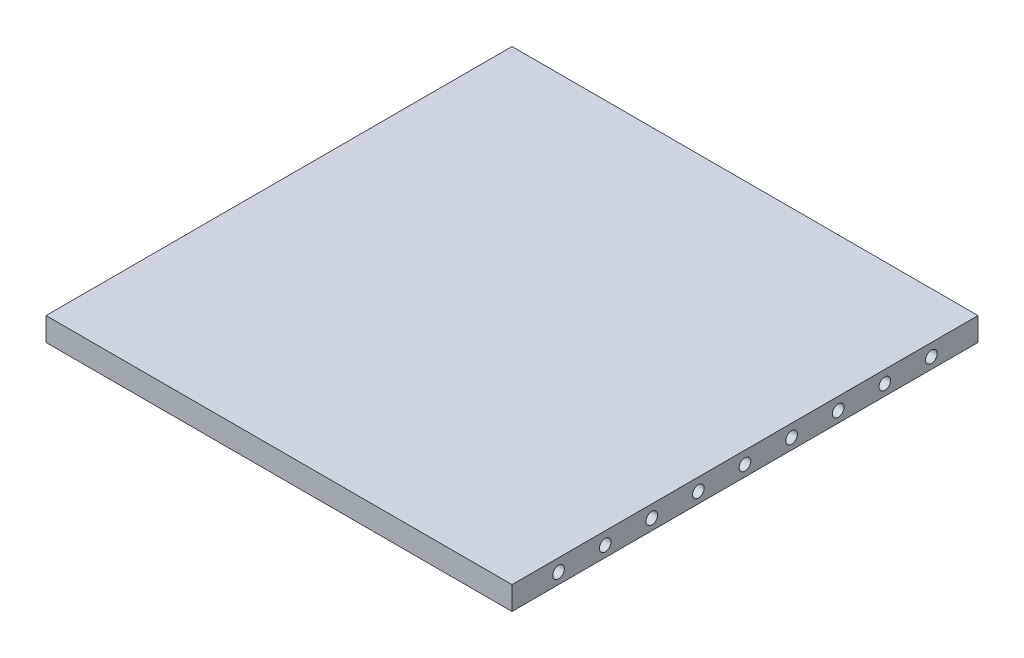
ISO-10303-21;
HEADER;
FILE_DESCRIPTION(('STEP AP214'),'2;1');
FILE_NAME('part.step','',(''),(''),'','','');
FILE_SCHEMA(('AUTOMOTIVE_DESIGN { 1 0 10303 214 1 1 1 1 }'));
ENDSEC;
DATA;
#1=APPLICATION_CONTEXT('core data for automotive mechanical design processes');
#2=APPLICATION_PROTOCOL_DEFINITION('international standard','automotive_design',2000,#1);
#3=PRODUCT_CONTEXT('',#1,'mechanical');
#4=PRODUCT('Part','Part','',(#3));
#5=PRODUCT_RELATED_PRODUCT_CATEGORY('part','',(#4));
#6=PRODUCT_DEFINITION_FORMATION('','',#4);
#7=PRODUCT_DEFINITION_CONTEXT('part definition',#1,'design');
#8=PRODUCT_DEFINITION('design','',#6,#7);
#9=PRODUCT_DEFINITION_SHAPE('','',#8);
#10=(LENGTH_UNIT() NAMED_UNIT(*) SI_UNIT(.MILLI.,.METRE.));
#11=(NAMED_UNIT(*) PLANE_ANGLE_UNIT() SI_UNIT($,.RADIAN.));
#12=(NAMED_UNIT(*) SI_UNIT($,.STERADIAN.) SOLID_ANGLE_UNIT());
#13=UNCERTAINTY_MEASURE_WITH_UNIT(LENGTH_MEASURE(1.E-05),#10,'distance_accuracy_value','');
#14=(GEOMETRIC_REPRESENTATION_CONTEXT(3) GLOBAL_UNCERTAINTY_ASSIGNED_CONTEXT((#13)) GLOBAL_UNIT_ASSIGNED_CONTEXT((#10,
#11,#12)) REPRESENTATION_CONTEXT('',''));
#15=CARTESIAN_POINT('',(0.,0.,0.));
#16=DIRECTION('',(0.,0.,1.));
#17=DIRECTION('',(1.,0.,0.));
#18=AXIS2_PLACEMENT_3D('',#15,#16,#17);
#19=CARTESIAN_POINT('',(63.5,6.35,63.5));
#20=DIRECTION('',(-1.,0.,0.));
#21=DIRECTION('',(0.,0.,1.));
#22=AXIS2_PLACEMENT_3D('',#19,#20,#21);
#23=PLANE('',#22);
#24=CARTESIAN_POINT('',(63.5,2.9738017173031,-38.1));
#25=DIRECTION('',(-1.,0.,0.));
#26=DIRECTION('',(0.,0.,1.));
#27=AXIS2_PLACEMENT_3D('',#24,#25,#26);
#28=CIRCLE('',#27,1.5875);
#29=CARTESIAN_POINT('',(63.5,2.9738017173031,-36.5125));
#30=VERTEX_POINT('',#29);
#31=EDGE_CURVE('E315',#30,#30,#28,.F.);
#32=ORIENTED_EDGE('',*,*,#31,.F.);
#33=EDGE_LOOP('',(#32));
#34=FACE_BOUND('',#33,.T.);
#35=CARTESIAN_POINT('',(63.5,2.9738017173031,-50.8));
#36=DIRECTION('',(-1.,0.,0.));
#37=DIRECTION('',(0.,0.,1.));
#38=AXIS2_PLACEMENT_3D('',#35,#36,#37);
#39=CIRCLE('',#38,1.5875);
#40=CARTESIAN_POINT('',(63.5,2.9738017173031,-49.2125));
#41=VERTEX_POINT('',#40);
#42=EDGE_CURVE('E109',#41,#41,#39,.F.);
#43=ORIENTED_EDGE('',*,*,#42,.F.);
#44=EDGE_LOOP('',(#43));
#45=FACE_BOUND('',#44,.T.);
#46=DIRECTION('',(0.,0.,-1.));
#47=VECTOR('',#46,1.);
#48=CARTESIAN_POINT('',(63.5,0.,63.5));
#49=LINE('',#48,#47);
#50=CARTESIAN_POINT('',(63.5,0.,63.5));
#51=VERTEX_POINT('',#50);
#52=CARTESIAN_POINT('',(63.5,0.,-63.5));
#53=VERTEX_POINT('',#52);
#54=EDGE_CURVE('E106',#51,#53,#49,.T.);
#55=ORIENTED_EDGE('',*,*,#54,.T.);
#56=DIRECTION('',(0.,-1.,0.));
#57=VECTOR('',#56,1.);
#58=CARTESIAN_POINT('',(63.5,6.35,-63.5));
#59=LINE('',#58,#57);
#60=CARTESIAN_POINT('',(63.5,6.35,-63.5));
#61=VERTEX_POINT('',#60);
#62=EDGE_CURVE('E96',#61,#53,#59,.T.);
#63=ORIENTED_EDGE('',*,*,#62,.F.);
#64=DIRECTION('',(0.,0.,-1.));
#65=VECTOR('',#64,1.);
#66=CARTESIAN_POINT('',(63.5,6.35,63.5));
#67=LINE('',#66,#65);
#68=CARTESIAN_POINT('',(63.5,6.35,63.5));
#69=VERTEX_POINT('',#68);
#70=EDGE_CURVE('E90',#69,#61,#67,.T.);
#71=ORIENTED_EDGE('',*,*,#70,.F.);
#72=DIRECTION('',(0.,-1.,0.));
#73=VECTOR('',#72,1.);
#74=CARTESIAN_POINT('',(63.5,6.35,63.5));
#75=LINE('',#74,#73);
#76=EDGE_CURVE('E102',#69,#51,#75,.T.);
#77=ORIENTED_EDGE('',*,*,#76,.T.);
#78=EDGE_LOOP('',(#55,#63,#71,#77));
#79=FACE_BOUND('',#78,.T.);
#80=CARTESIAN_POINT('',(63.5,2.9738017173031,-25.4));
#81=DIRECTION('',(-1.,0.,0.));
#82=DIRECTION('',(0.,0.,1.));
#83=AXIS2_PLACEMENT_3D('',#80,#81,#82);
#84=CIRCLE('',#83,1.5875);
#85=CARTESIAN_POINT('',(63.5,2.9738017173031,-23.8125));
#86=VERTEX_POINT('',#85);
#87=EDGE_CURVE('E119',#86,#86,#84,.F.);
#88=ORIENTED_EDGE('',*,*,#87,.F.);
#89=EDGE_LOOP('',(#88));
#90=FACE_BOUND('',#89,.T.);
#91=CARTESIAN_POINT('',(63.5,2.9738017173031,-12.7));
#92=DIRECTION('',(-1.,0.,0.));
#93=DIRECTION('',(0.,0.,1.));
#94=AXIS2_PLACEMENT_3D('',#91,#92,#93);
#95=CIRCLE('',#94,1.5875);
#96=CARTESIAN_POINT('',(63.5,2.9738017173031,-11.1125));
#97=VERTEX_POINT('',#96);
#98=EDGE_CURVE('E125',#97,#97,#95,.F.);
#99=ORIENTED_EDGE('',*,*,#98,.F.);
#100=EDGE_LOOP('',(#99));
#101=FACE_BOUND('',#100,.T.);
#102=CARTESIAN_POINT('',(63.5,2.9738017173031,0.));
#103=DIRECTION('',(-1.,0.,0.));
#104=DIRECTION('',(0.,0.,1.));
#105=AXIS2_PLACEMENT_3D('',#102,#103,#104);
#106=CIRCLE('',#105,1.5875);
#107=CARTESIAN_POINT('',(63.5,2.9738017173031,1.5875));
#108=VERTEX_POINT('',#107);
#109=EDGE_CURVE('E131',#108,#108,#106,.F.);
#110=ORIENTED_EDGE('',*,*,#109,.F.);
#111=EDGE_LOOP('',(#110));
#112=FACE_BOUND('',#111,.T.);
#113=CARTESIAN_POINT('',(63.5,2.9738017173031,12.7));
#114=DIRECTION('',(-1.,0.,0.));
#115=DIRECTION('',(0.,0.,1.));
#116=AXIS2_PLACEMENT_3D('',#113,#114,#115);
#117=CIRCLE('',#116,1.5875);
#118=CARTESIAN_POINT('',(63.5,2.9738017173031,14.2875));
#119=VERTEX_POINT('',#118);
#120=EDGE_CURVE('E137',#119,#119,#117,.F.);
#121=ORIENTED_EDGE('',*,*,#120,.F.);
#122=EDGE_LOOP('',(#121));
#123=FACE_BOUND('',#122,.T.);
#124=CARTESIAN_POINT('',(63.5,2.9738017173031,25.4));
#125=DIRECTION('',(-1.,0.,0.));
#126=DIRECTION('',(0.,0.,1.));
#127=AXIS2_PLACEMENT_3D('',#124,#125,#126);
#128=CIRCLE('',#127,1.5875);
#129=CARTESIAN_POINT('',(63.5,2.9738017173031,26.9875));
#130=VERTEX_POINT('',#129);
#131=EDGE_CURVE('E143',#130,#130,#128,.F.);
#132=ORIENTED_EDGE('',*,*,#131,.F.);
#133=EDGE_LOOP('',(#132));
#134=FACE_BOUND('',#133,.T.);
#135=CARTESIAN_POINT('',(63.5,2.9738017173031,38.1));
#136=DIRECTION('',(-1.,0.,0.));
#137=DIRECTION('',(0.,0.,1.));
#138=AXIS2_PLACEMENT_3D('',#135,#136,#137);
#139=CIRCLE('',#138,1.5875);
#140=CARTESIAN_POINT('',(63.5,2.9738017173031,39.6875));
#141=VERTEX_POINT('',#140);
#142=EDGE_CURVE('E149',#141,#141,#139,.F.);
#143=ORIENTED_EDGE('',*,*,#142,.F.);
#144=EDGE_LOOP('',(#143));
#145=FACE_BOUND('',#144,.T.);
#146=CARTESIAN_POINT('',(63.5,2.9738017173031,50.8));
#147=DIRECTION('',(-1.,0.,0.));
#148=DIRECTION('',(0.,0.,1.));
#149=AXIS2_PLACEMENT_3D('',#146,#147,#148);
#150=CIRCLE('',#149,1.5875);
#151=CARTESIAN_POINT('',(63.5,2.9738017173031,52.3875));
#152=VERTEX_POINT('',#151);
#153=EDGE_CURVE('E11',#152,#152,#150,.F.);
#154=ORIENTED_EDGE('',*,*,#153,.F.);
#155=EDGE_LOOP('',(#154));
#156=FACE_BOUND('',#155,.T.);
#157=ADVANCED_FACE('F37',(#34,#45,#79,#90,#101,#112,#123,#134,#145,#156),#23,.F.);
#158=CARTESIAN_POINT('',(-63.5,6.35,-63.5));
#159=DIRECTION('',(0.,0.,1.));
#160=DIRECTION('',(1.,0.,0.));
#161=AXIS2_PLACEMENT_3D('',#158,#159,#160);
#162=PLANE('',#161);
#163=DIRECTION('',(-1.,0.,0.));
#164=VECTOR('',#163,1.);
#165=CARTESIAN_POINT('',(-63.5,0.,-63.5));
#166=LINE('',#165,#164);
#167=CARTESIAN_POINT('',(-63.5,0.,-63.5));
#168=VERTEX_POINT('',#167);
#169=EDGE_CURVE('E95',#53,#168,#166,.T.);
#170=ORIENTED_EDGE('',*,*,#169,.T.);
#171=DIRECTION('',(0.,-1.,0.));
#172=VECTOR('',#171,1.);
#173=CARTESIAN_POINT('',(-63.5,6.35,-63.5));
#174=LINE('',#173,#172);
#175=CARTESIAN_POINT('',(-63.5,6.35,-63.5));
#176=VERTEX_POINT('',#175);
#177=EDGE_CURVE('E93',#176,#168,#174,.T.);
#178=ORIENTED_EDGE('',*,*,#177,.F.);
#179=DIRECTION('',(-1.,0.,0.));
#180=VECTOR('',#179,1.);
#181=CARTESIAN_POINT('',(-63.5,6.35,-63.5));
#182=LINE('',#181,#180);
#183=EDGE_CURVE('E85',#61,#176,#182,.T.);
#184=ORIENTED_EDGE('',*,*,#183,.F.);
#185=ORIENTED_EDGE('',*,*,#62,.T.);
#186=EDGE_LOOP('',(#170,#178,#184,#185));
#187=FACE_BOUND('',#186,.T.);
#188=ADVANCED_FACE('F94',(#187),#162,.F.);
#189=CARTESIAN_POINT('',(-63.5,6.35,63.5));
#190=DIRECTION('',(1.,0.,0.));
#191=DIRECTION('',(0.,0.,-1.));
#192=AXIS2_PLACEMENT_3D('',#189,#190,#191);
#193=PLANE('',#192);
#194=CARTESIAN_POINT('',(-63.5,2.9738017173031,-38.1));
#195=DIRECTION('',(-1.,0.,0.));
#196=DIRECTION('',(0.,0.,1.));
#197=AXIS2_PLACEMENT_3D('',#194,#195,#196);
#198=CIRCLE('',#197,1.5875);
#199=CARTESIAN_POINT('',(-63.5,2.9738017173031,-36.5125));
#200=VERTEX_POINT('',#199);
#201=EDGE_CURVE('E318',#200,#200,#198,.T.);
#202=ORIENTED_EDGE('',*,*,#201,.F.);
#203=EDGE_LOOP('',(#202));
#204=FACE_BOUND('',#203,.T.);
#205=CARTESIAN_POINT('',(-63.5,2.9738017173031,-50.8));
#206=DIRECTION('',(-1.,0.,0.));
#207=DIRECTION('',(0.,0.,1.));
#208=AXIS2_PLACEMENT_3D('',#205,#206,#207);
#209=CIRCLE('',#208,1.5875);
#210=CARTESIAN_POINT('',(-63.5,2.9738017173031,-49.2125));
#211=VERTEX_POINT('',#210);
#212=EDGE_CURVE('E312',#211,#211,#209,.T.);
#213=ORIENTED_EDGE('',*,*,#212,.F.);
#214=EDGE_LOOP('',(#213));
#215=FACE_BOUND('',#214,.T.);
#216=DIRECTION('',(0.,0.,1.));
#217=VECTOR('',#216,1.);
#218=CARTESIAN_POINT('',(-63.5,0.,63.5));
#219=LINE('',#218,#217);
#220=CARTESIAN_POINT('',(-63.5,0.,63.5));
#221=VERTEX_POINT('',#220);
#222=EDGE_CURVE('E71',#168,#221,#219,.T.);
#223=ORIENTED_EDGE('',*,*,#222,.T.);
#224=DIRECTION('',(0.,-1.,0.));
#225=VECTOR('',#224,1.);
#226=CARTESIAN_POINT('',(-63.5,6.35,63.5));
#227=LINE('',#226,#225);
#228=CARTESIAN_POINT('',(-63.5,6.35,63.5));
#229=VERTEX_POINT('',#228);
#230=EDGE_CURVE('E97',#229,#221,#227,.T.);
#231=ORIENTED_EDGE('',*,*,#230,.F.);
#232=DIRECTION('',(0.,0.,1.));
#233=VECTOR('',#232,1.);
#234=CARTESIAN_POINT('',(-63.5,6.35,63.5));
#235=LINE('',#234,#233);
#236=EDGE_CURVE('E88',#176,#229,#235,.T.);
#237=ORIENTED_EDGE('',*,*,#236,.F.);
#238=ORIENTED_EDGE('',*,*,#177,.T.);
#239=EDGE_LOOP('',(#223,#231,#237,#238));
#240=FACE_BOUND('',#239,.T.);
#241=CARTESIAN_POINT('',(-63.5,2.9738017173031,-25.4));
#242=DIRECTION('',(-1.,0.,0.));
#243=DIRECTION('',(0.,0.,1.));
#244=AXIS2_PLACEMENT_3D('',#241,#242,#243);
#245=CIRCLE('',#244,1.5875);
#246=CARTESIAN_POINT('',(-63.5,2.9738017173031,-23.8125));
#247=VERTEX_POINT('',#246);
#248=EDGE_CURVE('E116',#247,#247,#245,.T.);
#249=ORIENTED_EDGE('',*,*,#248,.F.);
#250=EDGE_LOOP('',(#249));
#251=FACE_BOUND('',#250,.T.);
#252=CARTESIAN_POINT('',(-63.5,2.9738017173031,-12.7));
#253=DIRECTION('',(-1.,0.,0.));
#254=DIRECTION('',(0.,0.,1.));
#255=AXIS2_PLACEMENT_3D('',#252,#253,#254);
#256=CIRCLE('',#255,1.5875);
#257=CARTESIAN_POINT('',(-63.5,2.9738017173031,-11.1125));
#258=VERTEX_POINT('',#257);
#259=EDGE_CURVE('E122',#258,#258,#256,.T.);
#260=ORIENTED_EDGE('',*,*,#259,.F.);
#261=EDGE_LOOP('',(#260));
#262=FACE_BOUND('',#261,.T.);
#263=CARTESIAN_POINT('',(-63.5,2.9738017173031,0.));
#264=DIRECTION('',(-1.,0.,0.));
#265=DIRECTION('',(0.,0.,1.));
#266=AXIS2_PLACEMENT_3D('',#263,#264,#265);
#267=CIRCLE('',#266,1.5875);
#268=CARTESIAN_POINT('',(-63.5,2.9738017173031,1.5875));
#269=VERTEX_POINT('',#268);
#270=EDGE_CURVE('E128',#269,#269,#267,.T.);
#271=ORIENTED_EDGE('',*,*,#270,.F.);
#272=EDGE_LOOP('',(#271));
#273=FACE_BOUND('',#272,.T.);
#274=CARTESIAN_POINT('',(-63.5,2.9738017173031,12.7));
#275=DIRECTION('',(-1.,0.,0.));
#276=DIRECTION('',(0.,0.,1.));
#277=AXIS2_PLACEMENT_3D('',#274,#275,#276);
#278=CIRCLE('',#277,1.5875);
#279=CARTESIAN_POINT('',(-63.5,2.9738017173031,14.2875));
#280=VERTEX_POINT('',#279);
#281=EDGE_CURVE('E134',#280,#280,#278,.T.);
#282=ORIENTED_EDGE('',*,*,#281,.F.);
#283=EDGE_LOOP('',(#282));
#284=FACE_BOUND('',#283,.T.);
#285=CARTESIAN_POINT('',(-63.5,2.9738017173031,25.4));
#286=DIRECTION('',(-1.,0.,0.));
#287=DIRECTION('',(0.,0.,1.));
#288=AXIS2_PLACEMENT_3D('',#285,#286,#287);
#289=CIRCLE('',#288,1.5875);
#290=CARTESIAN_POINT('',(-63.5,2.9738017173031,26.9875));
#291=VERTEX_POINT('',#290);
#292=EDGE_CURVE('E140',#291,#291,#289,.T.);
#293=ORIENTED_EDGE('',*,*,#292,.F.);
#294=EDGE_LOOP('',(#293));
#295=FACE_BOUND('',#294,.T.);
#296=CARTESIAN_POINT('',(-63.5,2.9738017173031,38.1));
#297=DIRECTION('',(-1.,0.,0.));
#298=DIRECTION('',(0.,0.,1.));
#299=AXIS2_PLACEMENT_3D('',#296,#297,#298);
#300=CIRCLE('',#299,1.5875);
#301=CARTESIAN_POINT('',(-63.5,2.9738017173031,39.6875));
#302=VERTEX_POINT('',#301);
#303=EDGE_CURVE('E146',#302,#302,#300,.T.);
#304=ORIENTED_EDGE('',*,*,#303,.F.);
#305=EDGE_LOOP('',(#304));
#306=FACE_BOUND('',#305,.T.);
#307=CARTESIAN_POINT('',(-63.5,2.9738017173031,50.8));
#308=DIRECTION('',(-1.,0.,0.));
#309=DIRECTION('',(0.,0.,1.));
#310=AXIS2_PLACEMENT_3D('',#307,#308,#309);
#311=CIRCLE('',#310,1.5875);
#312=CARTESIAN_POINT('',(-63.5,2.9738017173031,52.3875));
#313=VERTEX_POINT('',#312);
#314=EDGE_CURVE('E46',#313,#313,#311,.T.);
#315=ORIENTED_EDGE('',*,*,#314,.F.);
#316=EDGE_LOOP('',(#315));
#317=FACE_BOUND('',#316,.T.);
#318=ADVANCED_FACE('F99',(#204,#215,#240,#251,#262,#273,#284,#295,#306,#317),#193,.F.);
#319=CARTESIAN_POINT('',(-63.5,6.35,63.5));
#320=DIRECTION('',(0.,0.,-1.));
#321=DIRECTION('',(-1.,0.,0.));
#322=AXIS2_PLACEMENT_3D('',#319,#320,#321);
#323=PLANE('',#322);
#324=DIRECTION('',(1.,0.,0.));
#325=VECTOR('',#324,1.);
#326=CARTESIAN_POINT('',(-63.5,0.,63.5));
#327=LINE('',#326,#325);
#328=EDGE_CURVE('E77',#221,#51,#327,.T.);
#329=ORIENTED_EDGE('',*,*,#328,.T.);
#330=ORIENTED_EDGE('',*,*,#76,.F.);
#331=DIRECTION('',(1.,0.,0.));
#332=VECTOR('',#331,1.);
#333=CARTESIAN_POINT('',(-63.5,6.35,63.5));
#334=LINE('',#333,#332);
#335=EDGE_CURVE('E54',#229,#69,#334,.T.);
#336=ORIENTED_EDGE('',*,*,#335,.F.);
#337=ORIENTED_EDGE('',*,*,#230,.T.);
#338=EDGE_LOOP('',(#329,#330,#336,#337));
#339=FACE_BOUND('',#338,.T.);
#340=ADVANCED_FACE('F157',(#339),#323,.F.);
#341=CARTESIAN_POINT('',(0.,6.35,0.));
#342=DIRECTION('',(0.,-1.,0.));
#343=DIRECTION('',(0.,0.,-1.));
#344=AXIS2_PLACEMENT_3D('',#341,#342,#343);
#345=PLANE('',#344);
#346=ORIENTED_EDGE('',*,*,#70,.T.);
#347=ORIENTED_EDGE('',*,*,#183,.T.);
#348=ORIENTED_EDGE('',*,*,#236,.T.);
#349=ORIENTED_EDGE('',*,*,#335,.T.);
#350=EDGE_LOOP('',(#346,#347,#348,#349));
#351=FACE_BOUND('',#350,.T.);
#352=ADVANCED_FACE('F86',(#351),#345,.F.);
#353=CARTESIAN_POINT('',(0.,0.,0.));
#354=DIRECTION('',(0.,-1.,0.));
#355=DIRECTION('',(0.,0.,-1.));
#356=AXIS2_PLACEMENT_3D('',#353,#354,#355);
#357=PLANE('',#356);
#358=ORIENTED_EDGE('',*,*,#54,.F.);
#359=ORIENTED_EDGE('',*,*,#328,.F.);
#360=ORIENTED_EDGE('',*,*,#222,.F.);
#361=ORIENTED_EDGE('',*,*,#169,.F.);
#362=EDGE_LOOP('',(#358,#359,#360,#361));
#363=FACE_BOUND('',#362,.T.);
#364=ADVANCED_FACE('F264',(#363),#357,.T.);
#365=CARTESIAN_POINT('',(63.501,2.9738017173031,-50.8));
#366=DIRECTION('',(-1.,0.,0.));
#367=DIRECTION('',(0.,0.,1.));
#368=AXIS2_PLACEMENT_3D('',#365,#366,#367);
#369=CYLINDRICAL_SURFACE('',#368,1.5875);
#370=ORIENTED_EDGE('',*,*,#212,.T.);
#371=EDGE_LOOP('',(#370));
#372=FACE_BOUND('',#371,.T.);
#373=ORIENTED_EDGE('',*,*,#42,.T.);
#374=EDGE_LOOP('',(#373));
#375=FACE_BOUND('',#374,.T.);
#376=ADVANCED_FACE('F254',(#372,#375),#369,.F.);
#377=CARTESIAN_POINT('',(63.501,2.9738017173031,-38.1));
#378=DIRECTION('',(-1.,0.,0.));
#379=DIRECTION('',(0.,0.,1.));
#380=AXIS2_PLACEMENT_3D('',#377,#378,#379);
#381=CYLINDRICAL_SURFACE('',#380,1.5875);
#382=ORIENTED_EDGE('',*,*,#201,.T.);
#383=EDGE_LOOP('',(#382));
#384=FACE_BOUND('',#383,.T.);
#385=ORIENTED_EDGE('',*,*,#31,.T.);
#386=EDGE_LOOP('',(#385));
#387=FACE_BOUND('',#386,.T.);
#388=ADVANCED_FACE('F182',(#384,#387),#381,.F.);
#389=CARTESIAN_POINT('',(63.501,2.9738017173031,-25.4));
#390=DIRECTION('',(-1.,0.,0.));
#391=DIRECTION('',(0.,0.,1.));
#392=AXIS2_PLACEMENT_3D('',#389,#390,#391);
#393=CYLINDRICAL_SURFACE('',#392,1.5875);
#394=ORIENTED_EDGE('',*,*,#248,.T.);
#395=EDGE_LOOP('',(#394));
#396=FACE_BOUND('',#395,.T.);
#397=ORIENTED_EDGE('',*,*,#87,.T.);
#398=EDGE_LOOP('',(#397));
#399=FACE_BOUND('',#398,.T.);
#400=ADVANCED_FACE('F178',(#396,#399),#393,.F.);
#401=CARTESIAN_POINT('',(63.501,2.9738017173031,-12.7));
#402=DIRECTION('',(-1.,0.,0.));
#403=DIRECTION('',(0.,0.,1.));
#404=AXIS2_PLACEMENT_3D('',#401,#402,#403);
#405=CYLINDRICAL_SURFACE('',#404,1.5875);
#406=ORIENTED_EDGE('',*,*,#259,.T.);
#407=EDGE_LOOP('',(#406));
#408=FACE_BOUND('',#407,.T.);
#409=ORIENTED_EDGE('',*,*,#98,.T.);
#410=EDGE_LOOP('',(#409));
#411=FACE_BOUND('',#410,.T.);
#412=ADVANCED_FACE('F181',(#408,#411),#405,.F.);
#413=CARTESIAN_POINT('',(63.501,2.9738017173031,0.));
#414=DIRECTION('',(-1.,0.,0.));
#415=DIRECTION('',(0.,0.,1.));
#416=AXIS2_PLACEMENT_3D('',#413,#414,#415);
#417=CYLINDRICAL_SURFACE('',#416,1.5875);
#418=ORIENTED_EDGE('',*,*,#270,.T.);
#419=EDGE_LOOP('',(#418));
#420=FACE_BOUND('',#419,.T.);
#421=ORIENTED_EDGE('',*,*,#109,.T.);
#422=EDGE_LOOP('',(#421));
#423=FACE_BOUND('',#422,.T.);
#424=ADVANCED_FACE('F186',(#420,#423),#417,.F.);
#425=CARTESIAN_POINT('',(63.501,2.9738017173031,12.7));
#426=DIRECTION('',(-1.,0.,0.));
#427=DIRECTION('',(0.,0.,1.));
#428=AXIS2_PLACEMENT_3D('',#425,#426,#427);
#429=CYLINDRICAL_SURFACE('',#428,1.5875);
#430=ORIENTED_EDGE('',*,*,#281,.T.);
#431=EDGE_LOOP('',(#430));
#432=FACE_BOUND('',#431,.T.);
#433=ORIENTED_EDGE('',*,*,#120,.T.);
#434=EDGE_LOOP('',(#433));
#435=FACE_BOUND('',#434,.T.);
#436=ADVANCED_FACE('F190',(#432,#435),#429,.F.);
#437=CARTESIAN_POINT('',(63.501,2.9738017173031,25.4));
#438=DIRECTION('',(-1.,0.,0.));
#439=DIRECTION('',(0.,0.,1.));
#440=AXIS2_PLACEMENT_3D('',#437,#438,#439);
#441=CYLINDRICAL_SURFACE('',#440,1.5875);
#442=ORIENTED_EDGE('',*,*,#292,.T.);
#443=EDGE_LOOP('',(#442));
#444=FACE_BOUND('',#443,.T.);
#445=ORIENTED_EDGE('',*,*,#131,.T.);
#446=EDGE_LOOP('',(#445));
#447=FACE_BOUND('',#446,.T.);
#448=ADVANCED_FACE('F194',(#444,#447),#441,.F.);
#449=CARTESIAN_POINT('',(63.501,2.9738017173031,38.1));
#450=DIRECTION('',(-1.,0.,0.));
#451=DIRECTION('',(0.,0.,1.));
#452=AXIS2_PLACEMENT_3D('',#449,#450,#451);
#453=CYLINDRICAL_SURFACE('',#452,1.5875);
#454=ORIENTED_EDGE('',*,*,#303,.T.);
#455=EDGE_LOOP('',(#454));
#456=FACE_BOUND('',#455,.T.);
#457=ORIENTED_EDGE('',*,*,#142,.T.);
#458=EDGE_LOOP('',(#457));
#459=FACE_BOUND('',#458,.T.);
#460=ADVANCED_FACE('F197',(#456,#459),#453,.F.);
#461=CARTESIAN_POINT('',(63.501,2.9738017173031,50.8));
#462=DIRECTION('',(-1.,0.,0.));
#463=DIRECTION('',(0.,0.,1.));
#464=AXIS2_PLACEMENT_3D('',#461,#462,#463);
#465=CYLINDRICAL_SURFACE('',#464,1.5875);
#466=ORIENTED_EDGE('',*,*,#314,.T.);
#467=EDGE_LOOP('',(#466));
#468=FACE_BOUND('',#467,.T.);
#469=ORIENTED_EDGE('',*,*,#153,.T.);
#470=EDGE_LOOP('',(#469));
#471=FACE_BOUND('',#470,.T.);
#472=ADVANCED_FACE('F39',(#468,#471),#465,.F.);
#473=CLOSED_SHELL('',(#157,#188,#318,#340,#352,#364,#376,#388,#400,#412,#424,#436,#448,#460,#472));
#474=MANIFOLD_SOLID_BREP('B2',#473);
#475=ADVANCED_BREP_SHAPE_REPRESENTATION('',(#18,#474),#14);
#476=SHAPE_DEFINITION_REPRESENTATION(#9,#475);
ENDSEC;
END-ISO-10303-21;
